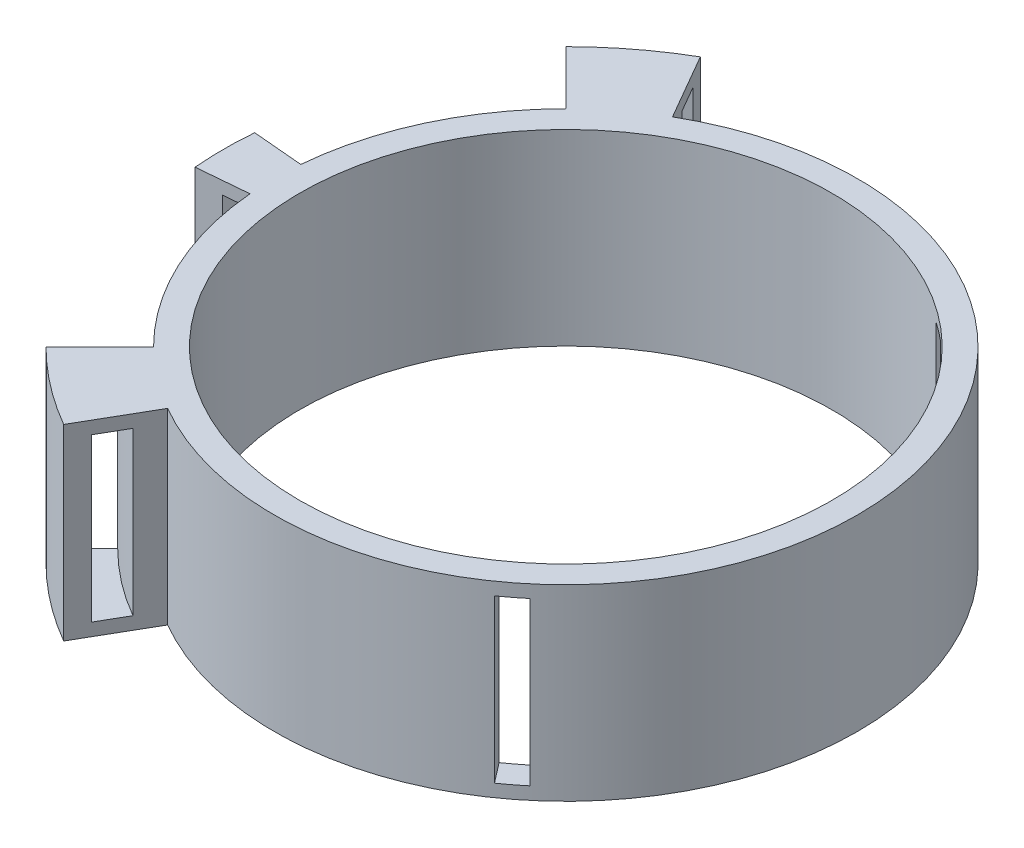
ISO-10303-21;
HEADER;
FILE_DESCRIPTION(('STEP AP214'),'2;1');
FILE_NAME('part.step','',(''),(''),'','','');
FILE_SCHEMA(('AUTOMOTIVE_DESIGN { 1 0 10303 214 1 1 1 1 }'));
ENDSEC;
DATA;
#1=APPLICATION_CONTEXT('core data for automotive mechanical design processes');
#2=APPLICATION_PROTOCOL_DEFINITION('international standard','automotive_design',2000,#1);
#3=PRODUCT_CONTEXT('',#1,'mechanical');
#4=PRODUCT('Part','Part','',(#3));
#5=PRODUCT_RELATED_PRODUCT_CATEGORY('part','',(#4));
#6=PRODUCT_DEFINITION_FORMATION('','',#4);
#7=PRODUCT_DEFINITION_CONTEXT('part definition',#1,'design');
#8=PRODUCT_DEFINITION('design','',#6,#7);
#9=PRODUCT_DEFINITION_SHAPE('','',#8);
#10=(LENGTH_UNIT() NAMED_UNIT(*) SI_UNIT(.MILLI.,.METRE.));
#11=(NAMED_UNIT(*) PLANE_ANGLE_UNIT() SI_UNIT($,.RADIAN.));
#12=(NAMED_UNIT(*) SI_UNIT($,.STERADIAN.) SOLID_ANGLE_UNIT());
#13=UNCERTAINTY_MEASURE_WITH_UNIT(LENGTH_MEASURE(1.E-05),#10,'distance_accuracy_value','');
#14=(GEOMETRIC_REPRESENTATION_CONTEXT(3) GLOBAL_UNCERTAINTY_ASSIGNED_CONTEXT((#13)) GLOBAL_UNIT_ASSIGNED_CONTEXT((#10,
#11,#12)) REPRESENTATION_CONTEXT('',''));
#15=CARTESIAN_POINT('',(0.,0.,0.));
#16=DIRECTION('',(0.,0.,1.));
#17=DIRECTION('',(1.,0.,0.));
#18=AXIS2_PLACEMENT_3D('',#15,#16,#17);
#19=CARTESIAN_POINT('',(0.,0.5,0.));
#20=DIRECTION('',(0.,-1.,0.));
#21=DIRECTION('',(0.,0.,-1.));
#22=AXIS2_PLACEMENT_3D('',#19,#20,#21);
#23=CYLINDRICAL_SURFACE('',#22,11.5);
#24=DIRECTION('',(0.,-1.,0.));
#25=VECTOR('',#24,1.);
#26=CARTESIAN_POINT('',(-11.4562390280551,7.4,1.00229104159798));
#27=LINE('',#26,#25);
#28=CARTESIAN_POINT('',(-11.4562390280551,7.4,1.00229104159798));
#29=VERTEX_POINT('',#28);
#30=CARTESIAN_POINT('',(-11.4562390280551,6.9,1.00229104159798));
#31=VERTEX_POINT('',#30);
#32=EDGE_CURVE('E53',#29,#31,#27,.T.);
#33=ORIENTED_EDGE('',*,*,#32,.T.);
#34=CARTESIAN_POINT('',(1.02175212735034E-12,6.9,0.));
#35=DIRECTION('',(0.,-1.,0.));
#36=DIRECTION('',(0.,0.,1.));
#37=AXIS2_PLACEMENT_3D('',#34,#35,#36);
#38=CIRCLE('',#37,11.500000000001);
#39=CARTESIAN_POINT('',(-11.4562390280551,6.9,-1.002291041598));
#40=VERTEX_POINT('',#39);
#41=EDGE_CURVE('E274',#31,#40,#38,.T.);
#42=ORIENTED_EDGE('',*,*,#41,.T.);
#43=DIRECTION('',(0.,-1.,0.));
#44=VECTOR('',#43,1.);
#45=CARTESIAN_POINT('',(-11.4562390280551,7.4,-1.002291041598));
#46=LINE('',#45,#44);
#47=CARTESIAN_POINT('',(-11.4562390280551,7.4,-1.002291041598));
#48=VERTEX_POINT('',#47);
#49=EDGE_CURVE('E278',#48,#40,#46,.T.);
#50=ORIENTED_EDGE('',*,*,#49,.F.);
#51=CARTESIAN_POINT('',(0.,7.4,0.));
#52=DIRECTION('',(0.,1.,0.));
#53=DIRECTION('',(0.,0.,1.));
#54=AXIS2_PLACEMENT_3D('',#51,#52,#53);
#55=CIRCLE('',#54,11.5);
#56=CARTESIAN_POINT('',(-8.13172798364533,7.4,-8.13172798364527));
#57=VERTEX_POINT('',#56);
#58=EDGE_CURVE('E384',#57,#48,#55,.T.);
#59=ORIENTED_EDGE('',*,*,#58,.F.);
#60=DIRECTION('',(0.,-1.,0.));
#61=VECTOR('',#60,1.);
#62=CARTESIAN_POINT('',(-8.13172798364534,0.5,-8.13172798364525));
#63=LINE('',#62,#61);
#64=CARTESIAN_POINT('',(-8.13172798364534,0.,-8.13172798364525));
#65=VERTEX_POINT('',#64);
#66=EDGE_CURVE('E61',#57,#65,#63,.T.);
#67=ORIENTED_EDGE('',*,*,#66,.T.);
#68=CARTESIAN_POINT('',(0.,0.,0.));
#69=DIRECTION('',(0.,1.,0.));
#70=DIRECTION('',(0.,0.,1.));
#71=AXIS2_PLACEMENT_3D('',#68,#69,#70);
#72=CIRCLE('',#71,11.5);
#73=CARTESIAN_POINT('',(-11.4562390280551,0.,-1.002291041598));
#74=VERTEX_POINT('',#73);
#75=EDGE_CURVE('E478',#65,#74,#72,.T.);
#76=ORIENTED_EDGE('',*,*,#75,.T.);
#77=DIRECTION('',(0.,-1.,0.));
#78=VECTOR('',#77,1.);
#79=CARTESIAN_POINT('',(-11.4562390280551,0.5,-1.002291041598));
#80=LINE('',#79,#78);
#81=CARTESIAN_POINT('',(-11.4562390280551,0.5,-1.002291041598));
#82=VERTEX_POINT('',#81);
#83=EDGE_CURVE('E496',#82,#74,#80,.T.);
#84=ORIENTED_EDGE('',*,*,#83,.F.);
#85=CARTESIAN_POINT('',(0.,0.5,0.));
#86=DIRECTION('',(0.,1.,0.));
#87=DIRECTION('',(0.,0.,1.));
#88=AXIS2_PLACEMENT_3D('',#85,#86,#87);
#89=CIRCLE('',#88,11.5);
#90=CARTESIAN_POINT('',(-11.4562390280551,0.5,1.00229104159798));
#91=VERTEX_POINT('',#90);
#92=EDGE_CURVE('E402',#82,#91,#89,.T.);
#93=ORIENTED_EDGE('',*,*,#92,.T.);
#94=DIRECTION('',(0.,-1.,0.));
#95=VECTOR('',#94,1.);
#96=CARTESIAN_POINT('',(-11.4562390280551,0.5,1.00229104159798));
#97=LINE('',#96,#95);
#98=CARTESIAN_POINT('',(-11.4562390280551,0.,1.00229104159798));
#99=VERTEX_POINT('',#98);
#100=EDGE_CURVE('E258',#91,#99,#97,.T.);
#101=ORIENTED_EDGE('',*,*,#100,.T.);
#102=CARTESIAN_POINT('',(0.,0.,0.));
#103=DIRECTION('',(0.,1.,0.));
#104=DIRECTION('',(0.,0.,1.));
#105=AXIS2_PLACEMENT_3D('',#102,#103,#104);
#106=CIRCLE('',#105,11.5);
#107=CARTESIAN_POINT('',(-8.13172798364534,0.,8.13172798364525));
#108=VERTEX_POINT('',#107);
#109=EDGE_CURVE('E485',#99,#108,#106,.T.);
#110=ORIENTED_EDGE('',*,*,#109,.T.);
#111=DIRECTION('',(0.,-1.,0.));
#112=VECTOR('',#111,1.);
#113=CARTESIAN_POINT('',(-8.13172798364534,0.5,8.13172798364525));
#114=LINE('',#113,#112);
#115=CARTESIAN_POINT('',(-8.13172798364535,7.4,8.13172798364525));
#116=VERTEX_POINT('',#115);
#117=EDGE_CURVE('E490',#116,#108,#114,.T.);
#118=ORIENTED_EDGE('',*,*,#117,.F.);
#119=EDGE_CURVE('E378',#29,#116,#55,.T.);
#120=ORIENTED_EDGE('',*,*,#119,.F.);
#121=EDGE_LOOP('',(#33,#42,#50,#59,#67,#76,#84,#93,#101,#110,#118,#120));
#122=FACE_BOUND('',#121,.T.);
#123=ADVANCED_FACE('F38',(#122),#23,.T.);
#124=DIRECTION('',(0.,-1.,0.));
#125=VECTOR('',#124,1.);
#126=CARTESIAN_POINT('',(6.60150989500399,6.9,9.41647848753261));
#127=LINE('',#126,#125);
#128=CARTESIAN_POINT('',(6.60150989500399,6.9,9.41647848753261));
#129=VERTEX_POINT('',#128);
#130=CARTESIAN_POINT('',(6.60150989500399,0.5,9.41647848753261));
#131=VERTEX_POINT('',#130);
#132=EDGE_CURVE('E426',#129,#131,#127,.T.);
#133=ORIENTED_EDGE('',*,*,#132,.F.);
#134=CARTESIAN_POINT('',(0.,6.9,0.));
#135=DIRECTION('',(0.,1.,0.));
#136=DIRECTION('',(0.,0.,1.));
#137=AXIS2_PLACEMENT_3D('',#134,#135,#136);
#138=CIRCLE('',#137,11.5);
#139=CARTESIAN_POINT('',(7.39205751139518,6.9,8.80951109586827));
#140=VERTEX_POINT('',#139);
#141=EDGE_CURVE('E388',#129,#140,#138,.T.);
#142=ORIENTED_EDGE('',*,*,#141,.T.);
#143=DIRECTION('',(0.,-1.,0.));
#144=VECTOR('',#143,1.);
#145=CARTESIAN_POINT('',(7.39205751139518,6.9,8.80951109586827));
#146=LINE('',#145,#144);
#147=CARTESIAN_POINT('',(7.39205751139518,0.5,8.80951109586827));
#148=VERTEX_POINT('',#147);
#149=EDGE_CURVE('E437',#140,#148,#146,.T.);
#150=ORIENTED_EDGE('',*,*,#149,.T.);
#151=CARTESIAN_POINT('',(0.,0.5,0.));
#152=DIRECTION('',(0.,1.,0.));
#153=DIRECTION('',(0.,0.,1.));
#154=AXIS2_PLACEMENT_3D('',#151,#152,#153);
#155=CIRCLE('',#154,11.5);
#156=EDGE_CURVE('E443',#131,#148,#155,.T.);
#157=ORIENTED_EDGE('',*,*,#156,.F.);
#158=EDGE_LOOP('',(#133,#142,#150,#157));
#159=FACE_BOUND('',#158,.T.);
#160=CARTESIAN_POINT('',(-5.75000000000004,7.4,9.95929214352103));
#161=VERTEX_POINT('',#160);
#162=CARTESIAN_POINT('',(-5.75000000000005,7.4,-9.95929214352102));
#163=VERTEX_POINT('',#162);
#164=EDGE_CURVE('E380',#161,#163,#55,.T.);
#165=ORIENTED_EDGE('',*,*,#164,.F.);
#166=DIRECTION('',(0.,-1.,0.));
#167=VECTOR('',#166,1.);
#168=CARTESIAN_POINT('',(-5.75000000000005,0.5,9.95929214352102));
#169=LINE('',#168,#167);
#170=CARTESIAN_POINT('',(-5.75000000000005,0.,9.95929214352102));
#171=VERTEX_POINT('',#170);
#172=EDGE_CURVE('E46',#161,#171,#169,.T.);
#173=ORIENTED_EDGE('',*,*,#172,.T.);
#174=CARTESIAN_POINT('',(0.,0.,0.));
#175=DIRECTION('',(0.,1.,0.));
#176=DIRECTION('',(0.,0.,1.));
#177=AXIS2_PLACEMENT_3D('',#174,#175,#176);
#178=CIRCLE('',#177,11.5);
#179=CARTESIAN_POINT('',(-5.74999999999991,0.,-9.9592921435211));
#180=VERTEX_POINT('',#179);
#181=EDGE_CURVE('E470',#171,#180,#178,.T.);
#182=ORIENTED_EDGE('',*,*,#181,.T.);
#183=DIRECTION('',(0.,-1.,0.));
#184=VECTOR('',#183,1.);
#185=CARTESIAN_POINT('',(-5.74999999999991,0.5,-9.9592921435211));
#186=LINE('',#185,#184);
#187=EDGE_CURVE('E506',#163,#180,#186,.T.);
#188=ORIENTED_EDGE('',*,*,#187,.F.);
#189=EDGE_LOOP('',(#165,#173,#182,#188));
#190=FACE_BOUND('',#189,.T.);
#191=CARTESIAN_POINT('',(7.34818134856185,6.9,-8.84614214607972));
#192=VERTEX_POINT('',#191);
#193=CARTESIAN_POINT('',(6.55369685374077,6.9,-9.44981785799432));
#194=VERTEX_POINT('',#193);
#195=EDGE_CURVE('E379',#192,#194,#138,.T.);
#196=ORIENTED_EDGE('',*,*,#195,.T.);
#197=DIRECTION('',(0.,-1.,0.));
#198=VECTOR('',#197,1.);
#199=CARTESIAN_POINT('',(6.55369685374077,6.9,-9.44981785799432));
#200=LINE('',#199,#198);
#201=CARTESIAN_POINT('',(6.55369685374077,0.5,-9.44981785799432));
#202=VERTEX_POINT('',#201);
#203=EDGE_CURVE('E410',#194,#202,#200,.T.);
#204=ORIENTED_EDGE('',*,*,#203,.T.);
#205=CARTESIAN_POINT('',(0.,0.5,0.));
#206=DIRECTION('',(0.,1.,0.));
#207=DIRECTION('',(0.,0.,1.));
#208=AXIS2_PLACEMENT_3D('',#205,#206,#207);
#209=CIRCLE('',#208,11.5);
#210=CARTESIAN_POINT('',(7.34818134856185,0.5,-8.84614214607972));
#211=VERTEX_POINT('',#210);
#212=EDGE_CURVE('E449',#211,#202,#209,.T.);
#213=ORIENTED_EDGE('',*,*,#212,.F.);
#214=DIRECTION('',(0.,-1.,0.));
#215=VECTOR('',#214,1.);
#216=CARTESIAN_POINT('',(7.34818134856185,6.9,-8.84614214607972));
#217=LINE('',#216,#215);
#218=EDGE_CURVE('E399',#192,#211,#217,.T.);
#219=ORIENTED_EDGE('',*,*,#218,.F.);
#220=EDGE_LOOP('',(#196,#204,#213,#219));
#221=FACE_BOUND('',#220,.T.);
#222=ADVANCED_FACE('F511',(#159,#190,#221),#23,.T.);
#223=CARTESIAN_POINT('',(0.,0.5,0.));
#224=DIRECTION('',(0.,1.,0.));
#225=DIRECTION('',(0.,0.,1.));
#226=AXIS2_PLACEMENT_3D('',#223,#224,#225);
#227=PLANE('',#226);
#228=DIRECTION('',(-0.996194698091746,0.,-0.0871557427476519));
#229=VECTOR('',#228,1.);
#230=CARTESIAN_POINT('',(-11.4562390280551,0.5,-1.002291041598));
#231=LINE('',#230,#229);
#232=CARTESIAN_POINT('',(-12.4524337261468,0.5,-1.08944678434565));
#233=VERTEX_POINT('',#232);
#234=EDGE_CURVE('E455',#82,#233,#231,.T.);
#235=ORIENTED_EDGE('',*,*,#234,.T.);
#236=CARTESIAN_POINT('',(3.62557206479153E-13,0.5,0.));
#237=DIRECTION('',(0.,-1.,0.));
#238=DIRECTION('',(0.,0.,1.));
#239=AXIS2_PLACEMENT_3D('',#236,#237,#238);
#240=CIRCLE('',#239,12.5000000000004);
#241=CARTESIAN_POINT('',(-12.4524337261468,0.5,1.08944678434563));
#242=VERTEX_POINT('',#241);
#243=EDGE_CURVE('E310',#242,#233,#240,.T.);
#244=ORIENTED_EDGE('',*,*,#243,.F.);
#245=DIRECTION('',(0.996194698091746,0.,-0.0871557427476506));
#246=VECTOR('',#245,1.);
#247=CARTESIAN_POINT('',(-11.4562390280551,0.5,1.00229104159798));
#248=LINE('',#247,#246);
#249=EDGE_CURVE('E457',#242,#91,#248,.T.);
#250=ORIENTED_EDGE('',*,*,#249,.T.);
#251=ORIENTED_EDGE('',*,*,#92,.F.);
#252=EDGE_LOOP('',(#235,#244,#250,#251));
#253=FACE_BOUND('',#252,.T.);
#254=ADVANCED_FACE('F546',(#253),#227,.T.);
#255=DIRECTION('',(0.707106781186551,0.,0.707106781186544));
#256=VECTOR('',#255,1.);
#257=CARTESIAN_POINT('',(-8.13172798364534,0.5,-8.13172798364525));
#258=LINE('',#257,#256);
#259=CARTESIAN_POINT('',(-9.68736290225383,0.5,-9.68736290225461));
#260=VERTEX_POINT('',#259);
#261=CARTESIAN_POINT('',(-8.83883476482951,0.5,-8.83883476482941));
#262=VERTEX_POINT('',#261);
#263=EDGE_CURVE('E453',#260,#262,#258,.T.);
#264=ORIENTED_EDGE('',*,*,#263,.T.);
#265=CARTESIAN_POINT('',(3.50414142147315E-13,0.5,-4.33680868994202E-13));
#266=DIRECTION('',(0.,1.,0.));
#267=DIRECTION('',(0.,0.,-1.));
#268=AXIS2_PLACEMENT_3D('',#265,#266,#267);
#269=CIRCLE('',#268,12.4999999999972);
#270=CARTESIAN_POINT('',(-6.24999999999867,0.5,-10.8253175473034));
#271=VERTEX_POINT('',#270);
#272=EDGE_CURVE('E326',#271,#262,#269,.T.);
#273=ORIENTED_EDGE('',*,*,#272,.F.);
#274=DIRECTION('',(-0.499999999999992,0.,-0.866025403784443));
#275=VECTOR('',#274,1.);
#276=CARTESIAN_POINT('',(-5.74999999999991,0.5,-9.9592921435211));
#277=LINE('',#276,#275);
#278=CARTESIAN_POINT('',(-6.84999999999872,0.5,-11.8645480318448));
#279=VERTEX_POINT('',#278);
#280=EDGE_CURVE('E451',#271,#279,#277,.T.);
#281=ORIENTED_EDGE('',*,*,#280,.T.);
#282=CARTESIAN_POINT('',(3.50414142147315E-13,0.5,-4.33680868994202E-13));
#283=DIRECTION('',(0.,-1.,0.));
#284=DIRECTION('',(0.,0.,-1.));
#285=AXIS2_PLACEMENT_3D('',#282,#283,#284);
#286=CIRCLE('',#285,13.6999999999978);
#287=EDGE_CURVE('E338',#260,#279,#286,.T.);
#288=ORIENTED_EDGE('',*,*,#287,.F.);
#289=EDGE_LOOP('',(#264,#273,#281,#288));
#290=FACE_BOUND('',#289,.T.);
#291=ADVANCED_FACE('F603',(#290),#227,.T.);
#292=DIRECTION('',(-0.707106781186551,0.,0.707106781186544));
#293=VECTOR('',#292,1.);
#294=CARTESIAN_POINT('',(-8.13172798364534,0.5,8.13172798364526));
#295=LINE('',#294,#293);
#296=CARTESIAN_POINT('',(-8.8388347648295,0.5,8.83883476482942));
#297=VERTEX_POINT('',#296);
#298=CARTESIAN_POINT('',(-9.68736290225385,0.5,9.68736290225375));
#299=VERTEX_POINT('',#298);
#300=EDGE_CURVE('E459',#297,#299,#295,.T.);
#301=ORIENTED_EDGE('',*,*,#300,.T.);
#302=CARTESIAN_POINT('',(3.50414142147315E-13,0.5,-4.33680868994202E-13));
#303=DIRECTION('',(0.,-1.,0.));
#304=DIRECTION('',(0.,0.,1.));
#305=AXIS2_PLACEMENT_3D('',#302,#303,#304);
#306=CIRCLE('',#305,13.6999999999978);
#307=CARTESIAN_POINT('',(-6.84999999999871,0.5,11.8645480318444));
#308=VERTEX_POINT('',#307);
#309=EDGE_CURVE('E350',#308,#299,#306,.T.);
#310=ORIENTED_EDGE('',*,*,#309,.F.);
#311=DIRECTION('',(0.500000000000004,0.,-0.866025403784436));
#312=VECTOR('',#311,1.);
#313=CARTESIAN_POINT('',(-5.75000000000005,0.5,9.95929214352102));
#314=LINE('',#313,#312);
#315=CARTESIAN_POINT('',(-6.24999999999836,0.5,10.8253175473025));
#316=VERTEX_POINT('',#315);
#317=EDGE_CURVE('E441',#308,#316,#314,.T.);
#318=ORIENTED_EDGE('',*,*,#317,.T.);
#319=CARTESIAN_POINT('',(3.50414142147315E-13,0.5,-4.33680868994202E-13));
#320=DIRECTION('',(0.,1.,0.));
#321=DIRECTION('',(0.,0.,1.));
#322=AXIS2_PLACEMENT_3D('',#319,#320,#321);
#323=CIRCLE('',#322,12.4999999999972);
#324=EDGE_CURVE('E362',#297,#316,#323,.T.);
#325=ORIENTED_EDGE('',*,*,#324,.F.);
#326=EDGE_LOOP('',(#301,#310,#318,#325));
#327=FACE_BOUND('',#326,.T.);
#328=ADVANCED_FACE('F598',(#327),#227,.T.);
#329=CARTESIAN_POINT('',(0.,0.5,0.));
#330=DIRECTION('',(0.,-1.,0.));
#331=DIRECTION('',(0.,0.,1.));
#332=AXIS2_PLACEMENT_3D('',#329,#330,#331);
#333=CIRCLE('',#332,10.5);
#334=CARTESIAN_POINT('',(5.94807324018505,0.5,-8.65276977212468));
#335=VERTEX_POINT('',#334);
#336=CARTESIAN_POINT('',(6.70920905738256,0.5,-8.0769123942467));
#337=VERTEX_POINT('',#336);
#338=EDGE_CURVE('E446',#335,#337,#333,.T.);
#339=ORIENTED_EDGE('',*,*,#338,.T.);
#340=DIRECTION('',(-0.638972291179291,0.,0.769229751833019));
#341=VECTOR('',#340,1.);
#342=CARTESIAN_POINT('',(0.,0.5,0.));
#343=LINE('',#342,#341);
#344=EDGE_CURVE('E383',#211,#337,#343,.T.);
#345=ORIENTED_EDGE('',*,*,#344,.F.);
#346=ORIENTED_EDGE('',*,*,#212,.T.);
#347=DIRECTION('',(0.604999089059934,0.,-0.796226162743131));
#348=VECTOR('',#347,1.);
#349=CARTESIAN_POINT('',(-0.397242247410538,0.5,-0.301837855957302));
#350=LINE('',#349,#348);
#351=EDGE_CURVE('E407',#335,#202,#350,.T.);
#352=ORIENTED_EDGE('',*,*,#351,.F.);
#353=EDGE_LOOP('',(#339,#345,#346,#352));
#354=FACE_BOUND('',#353,.T.);
#355=ADVANCED_FACE('F595',(#354),#227,.T.);
#356=CARTESIAN_POINT('',(6.74926990170864,0.5,8.04346665274929));
#357=VERTEX_POINT('',#356);
#358=CARTESIAN_POINT('',(5.99189464633235,0.5,8.62248215696929));
#359=VERTEX_POINT('',#358);
#360=EDGE_CURVE('E447',#357,#359,#333,.T.);
#361=ORIENTED_EDGE('',*,*,#360,.T.);
#362=DIRECTION('',(-0.608988032530659,0.,-0.793179409865408));
#363=VECTOR('',#362,1.);
#364=CARTESIAN_POINT('',(-0.395273808195626,0.5,0.303483695832197));
#365=LINE('',#364,#363);
#366=EDGE_CURVE('E413',#131,#359,#365,.T.);
#367=ORIENTED_EDGE('',*,*,#366,.F.);
#368=ORIENTED_EDGE('',*,*,#156,.T.);
#369=DIRECTION('',(-0.642787609686537,0.,-0.76604444311898));
#370=VECTOR('',#369,1.);
#371=CARTESIAN_POINT('',(0.,0.5,0.));
#372=LINE('',#371,#370);
#373=EDGE_CURVE('E429',#148,#357,#372,.T.);
#374=ORIENTED_EDGE('',*,*,#373,.T.);
#375=EDGE_LOOP('',(#361,#367,#368,#374));
#376=FACE_BOUND('',#375,.T.);
#377=ADVANCED_FACE('F591',(#376),#227,.T.);
#378=CARTESIAN_POINT('',(0.,0.5,0.));
#379=DIRECTION('',(0.,-1.,0.));
#380=DIRECTION('',(0.,0.,-1.));
#381=AXIS2_PLACEMENT_3D('',#378,#379,#380);
#382=CYLINDRICAL_SURFACE('',#381,14.5);
#383=CARTESIAN_POINT('',(0.,0.,0.));
#384=DIRECTION('',(0.,1.,0.));
#385=DIRECTION('',(0.,0.,1.));
#386=AXIS2_PLACEMENT_3D('',#383,#384,#385);
#387=CIRCLE('',#386,14.5);
#388=CARTESIAN_POINT('',(-10.253048327205,0.,10.2530483272049));
#389=VERTEX_POINT('',#388);
#390=CARTESIAN_POINT('',(-7.25000000000006,0.,12.5573683548743));
#391=VERTEX_POINT('',#390);
#392=EDGE_CURVE('E440',#389,#391,#387,.T.);
#393=ORIENTED_EDGE('',*,*,#392,.T.);
#394=DIRECTION('',(0.,-1.,0.));
#395=VECTOR('',#394,1.);
#396=CARTESIAN_POINT('',(-7.25000000000006,0.5,12.5573683548743));
#397=LINE('',#396,#395);
#398=CARTESIAN_POINT('',(-7.25000000000006,7.4,12.5573683548743));
#399=VERTEX_POINT('',#398);
#400=EDGE_CURVE('E11',#399,#391,#397,.T.);
#401=ORIENTED_EDGE('',*,*,#400,.F.);
#402=CARTESIAN_POINT('',(0.,7.4,0.));
#403=DIRECTION('',(0.,1.,0.));
#404=DIRECTION('',(0.,0.,-1.));
#405=AXIS2_PLACEMENT_3D('',#402,#403,#404);
#406=CIRCLE('',#405,14.5000000000001);
#407=CARTESIAN_POINT('',(-10.253048327205,7.4,10.2530483272049));
#408=VERTEX_POINT('',#407);
#409=EDGE_CURVE('E304',#408,#399,#406,.T.);
#410=ORIENTED_EDGE('',*,*,#409,.F.);
#411=DIRECTION('',(0.,-1.,0.));
#412=VECTOR('',#411,1.);
#413=CARTESIAN_POINT('',(-10.253048327205,0.5,10.2530483272049));
#414=LINE('',#413,#412);
#415=EDGE_CURVE('E461',#408,#389,#414,.T.);
#416=ORIENTED_EDGE('',*,*,#415,.T.);
#417=EDGE_LOOP('',(#393,#401,#410,#416));
#418=FACE_BOUND('',#417,.T.);
#419=ADVANCED_FACE('F40',(#418),#382,.T.);
#420=CARTESIAN_POINT('',(-5.75000000000005,0.5,9.95929214352102));
#421=DIRECTION('',(-0.866025403784436,0.,-0.500000000000004));
#422=DIRECTION('',(-0.500000000000004,0.,0.866025403784436));
#423=AXIS2_PLACEMENT_3D('',#420,#421,#422);
#424=PLANE('',#423);
#425=ORIENTED_EDGE('',*,*,#172,.F.);
#426=DIRECTION('',(0.500000000000003,0.,-0.866025403784437));
#427=VECTOR('',#426,1.);
#428=CARTESIAN_POINT('',(-7.25000000000006,7.4,12.5573683548743));
#429=LINE('',#428,#427);
#430=EDGE_CURVE('E308',#399,#161,#429,.T.);
#431=ORIENTED_EDGE('',*,*,#430,.F.);
#432=ORIENTED_EDGE('',*,*,#400,.T.);
#433=DIRECTION('',(0.500000000000004,0.,-0.866025403784436));
#434=VECTOR('',#433,1.);
#435=CARTESIAN_POINT('',(-5.75000000000005,0.,9.95929214352102));
#436=LINE('',#435,#434);
#437=EDGE_CURVE('E464',#391,#171,#436,.T.);
#438=ORIENTED_EDGE('',*,*,#437,.T.);
#439=EDGE_LOOP('',(#425,#431,#432,#438));
#440=FACE_BOUND('',#439,.T.);
#441=DIRECTION('',(0.500000000000003,0.,-0.866025403784437));
#442=VECTOR('',#441,1.);
#443=CARTESIAN_POINT('',(-7.25000000000006,6.9,12.5573683548743));
#444=LINE('',#443,#442);
#445=CARTESIAN_POINT('',(-6.84999999999876,6.9,11.8645480318445));
#446=VERTEX_POINT('',#445);
#447=CARTESIAN_POINT('',(-6.24999999999837,6.9,10.8253175473025));
#448=VERTEX_POINT('',#447);
#449=EDGE_CURVE('E305',#446,#448,#444,.T.);
#450=ORIENTED_EDGE('',*,*,#449,.T.);
#451=DIRECTION('',(0.,-1.,0.));
#452=VECTOR('',#451,1.);
#453=CARTESIAN_POINT('',(-6.24999999999837,6.9,10.8253175473025));
#454=LINE('',#453,#452);
#455=EDGE_CURVE('E366',#448,#316,#454,.T.);
#456=ORIENTED_EDGE('',*,*,#455,.T.);
#457=ORIENTED_EDGE('',*,*,#317,.F.);
#458=DIRECTION('',(0.,-1.,0.));
#459=VECTOR('',#458,1.);
#460=CARTESIAN_POINT('',(-6.84999999999871,6.9,11.8645480318444));
#461=LINE('',#460,#459);
#462=EDGE_CURVE('E359',#446,#308,#461,.T.);
#463=ORIENTED_EDGE('',*,*,#462,.F.);
#464=EDGE_LOOP('',(#450,#456,#457,#463));
#465=FACE_BOUND('',#464,.T.);
#466=ADVANCED_FACE('F515',(#440,#465),#424,.F.);
#467=CARTESIAN_POINT('',(0.,0.5,0.));
#468=DIRECTION('',(0.,-1.,0.));
#469=DIRECTION('',(0.,0.,-1.));
#470=AXIS2_PLACEMENT_3D('',#467,#468,#469);
#471=CYLINDRICAL_SURFACE('',#470,10.5);
#472=CARTESIAN_POINT('',(0.,0.,0.));
#473=DIRECTION('',(0.,-1.,0.));
#474=DIRECTION('',(0.,0.,1.));
#475=AXIS2_PLACEMENT_3D('',#472,#473,#474);
#476=CIRCLE('',#475,10.5);
#477=CARTESIAN_POINT('',(0.,0.,10.5));
#478=VERTEX_POINT('',#477);
#479=EDGE_CURVE('E467',#478,#478,#476,.T.);
#480=ORIENTED_EDGE('',*,*,#479,.T.);
#481=EDGE_LOOP('',(#480));
#482=FACE_BOUND('',#481,.T.);
#483=DIRECTION('',(0.,-1.,0.));
#484=VECTOR('',#483,1.);
#485=CARTESIAN_POINT('',(6.74926990170864,6.9,8.04346665274929));
#486=LINE('',#485,#484);
#487=CARTESIAN_POINT('',(6.74926990170864,6.9,8.04346665274929));
#488=VERTEX_POINT('',#487);
#489=EDGE_CURVE('E433',#488,#357,#486,.T.);
#490=ORIENTED_EDGE('',*,*,#489,.F.);
#491=CARTESIAN_POINT('',(0.,6.9,0.));
#492=DIRECTION('',(0.,-1.,0.));
#493=DIRECTION('',(0.,0.,1.));
#494=AXIS2_PLACEMENT_3D('',#491,#492,#493);
#495=CIRCLE('',#494,10.5);
#496=CARTESIAN_POINT('',(5.99189464633235,6.9,8.62248215696929));
#497=VERTEX_POINT('',#496);
#498=EDGE_CURVE('E387',#488,#497,#495,.T.);
#499=ORIENTED_EDGE('',*,*,#498,.T.);
#500=DIRECTION('',(0.,-1.,0.));
#501=VECTOR('',#500,1.);
#502=CARTESIAN_POINT('',(5.99189464633235,6.9,8.62248215696929));
#503=LINE('',#502,#501);
#504=EDGE_CURVE('E423',#497,#359,#503,.T.);
#505=ORIENTED_EDGE('',*,*,#504,.T.);
#506=ORIENTED_EDGE('',*,*,#360,.F.);
#507=EDGE_LOOP('',(#490,#499,#505,#506));
#508=FACE_BOUND('',#507,.T.);
#509=DIRECTION('',(0.,-1.,0.));
#510=VECTOR('',#509,1.);
#511=CARTESIAN_POINT('',(5.94807324018505,6.9,-8.65276977212468));
#512=LINE('',#511,#510);
#513=CARTESIAN_POINT('',(5.94807324018505,6.9,-8.65276977212468));
#514=VERTEX_POINT('',#513);
#515=EDGE_CURVE('E420',#514,#335,#512,.T.);
#516=ORIENTED_EDGE('',*,*,#515,.F.);
#517=CARTESIAN_POINT('',(6.70920905738256,6.9,-8.0769123942467));
#518=VERTEX_POINT('',#517);
#519=EDGE_CURVE('E374',#514,#518,#495,.T.);
#520=ORIENTED_EDGE('',*,*,#519,.T.);
#521=DIRECTION('',(0.,-1.,0.));
#522=VECTOR('',#521,1.);
#523=CARTESIAN_POINT('',(6.70920905738256,6.9,-8.0769123942467));
#524=LINE('',#523,#522);
#525=EDGE_CURVE('E394',#518,#337,#524,.T.);
#526=ORIENTED_EDGE('',*,*,#525,.T.);
#527=ORIENTED_EDGE('',*,*,#338,.F.);
#528=EDGE_LOOP('',(#516,#520,#526,#527));
#529=FACE_BOUND('',#528,.T.);
#530=CARTESIAN_POINT('',(0.,7.4,0.));
#531=DIRECTION('',(0.,-1.,0.));
#532=DIRECTION('',(0.,0.,1.));
#533=AXIS2_PLACEMENT_3D('',#530,#531,#532);
#534=CIRCLE('',#533,10.5);
#535=CARTESIAN_POINT('',(0.,7.4,10.5));
#536=VERTEX_POINT('',#535);
#537=EDGE_CURVE('E375',#536,#536,#534,.T.);
#538=ORIENTED_EDGE('',*,*,#537,.F.);
#539=EDGE_LOOP('',(#538));
#540=FACE_BOUND('',#539,.T.);
#541=ADVANCED_FACE('F584',(#482,#508,#529,#540),#471,.F.);
#542=CARTESIAN_POINT('',(-5.74999999999991,0.5,-9.9592921435211));
#543=DIRECTION('',(-0.866025403784443,0.,0.499999999999992));
#544=DIRECTION('',(0.499999999999992,0.,0.866025403784443));
#545=AXIS2_PLACEMENT_3D('',#542,#543,#544);
#546=PLANE('',#545);
#547=DIRECTION('',(0.,-1.,0.));
#548=VECTOR('',#547,1.);
#549=CARTESIAN_POINT('',(-7.24999999999989,0.5,-12.5573683548744));
#550=LINE('',#549,#548);
#551=CARTESIAN_POINT('',(-7.25000000000006,7.4,-12.5573683548743));
#552=VERTEX_POINT('',#551);
#553=CARTESIAN_POINT('',(-7.24999999999989,0.,-12.5573683548744));
#554=VERTEX_POINT('',#553);
#555=EDGE_CURVE('E503',#552,#554,#550,.T.);
#556=ORIENTED_EDGE('',*,*,#555,.F.);
#557=DIRECTION('',(-0.500000000000004,0.,-0.866025403784436));
#558=VECTOR('',#557,1.);
#559=CARTESIAN_POINT('',(-7.25000000000006,7.4,-12.5573683548743));
#560=LINE('',#559,#558);
#561=EDGE_CURVE('E293',#163,#552,#560,.T.);
#562=ORIENTED_EDGE('',*,*,#561,.F.);
#563=ORIENTED_EDGE('',*,*,#187,.T.);
#564=DIRECTION('',(-0.499999999999992,0.,-0.866025403784443));
#565=VECTOR('',#564,1.);
#566=CARTESIAN_POINT('',(-5.74999999999991,0.,-9.9592921435211));
#567=LINE('',#566,#565);
#568=EDGE_CURVE('E472',#180,#554,#567,.T.);
#569=ORIENTED_EDGE('',*,*,#568,.T.);
#570=EDGE_LOOP('',(#556,#562,#563,#569));
#571=FACE_BOUND('',#570,.T.);
#572=DIRECTION('',(-0.500000000000004,0.,-0.866025403784436));
#573=VECTOR('',#572,1.);
#574=CARTESIAN_POINT('',(-7.25000000000006,6.9,-12.5573683548743));
#575=LINE('',#574,#573);
#576=CARTESIAN_POINT('',(-6.24999999999879,6.9,-10.8253175473033));
#577=VERTEX_POINT('',#576);
#578=CARTESIAN_POINT('',(-6.84999999999872,6.9,-11.8645480318453));
#579=VERTEX_POINT('',#578);
#580=EDGE_CURVE('E290',#577,#579,#575,.T.);
#581=ORIENTED_EDGE('',*,*,#580,.T.);
#582=DIRECTION('',(0.,-1.,0.));
#583=VECTOR('',#582,1.);
#584=CARTESIAN_POINT('',(-6.84999999999872,6.9,-11.8645480318453));
#585=LINE('',#584,#583);
#586=EDGE_CURVE('E342',#579,#279,#585,.T.);
#587=ORIENTED_EDGE('',*,*,#586,.T.);
#588=ORIENTED_EDGE('',*,*,#280,.F.);
#589=DIRECTION('',(0.,-1.,0.));
#590=VECTOR('',#589,1.);
#591=CARTESIAN_POINT('',(-6.24999999999838,6.9,-10.8253175473034));
#592=LINE('',#591,#590);
#593=EDGE_CURVE('E335',#577,#271,#592,.T.);
#594=ORIENTED_EDGE('',*,*,#593,.F.);
#595=EDGE_LOOP('',(#581,#587,#588,#594));
#596=FACE_BOUND('',#595,.T.);
#597=ADVANCED_FACE('F531',(#571,#596),#546,.F.);
#598=CARTESIAN_POINT('',(0.,0.5,0.));
#599=DIRECTION('',(0.,-1.,0.));
#600=DIRECTION('',(0.,0.,-1.));
#601=AXIS2_PLACEMENT_3D('',#598,#599,#600);
#602=CYLINDRICAL_SURFACE('',#601,14.5);
#603=CARTESIAN_POINT('',(0.,0.,0.));
#604=DIRECTION('',(0.,1.,0.));
#605=DIRECTION('',(0.,0.,1.));
#606=AXIS2_PLACEMENT_3D('',#603,#604,#605);
#607=CIRCLE('',#606,14.5);
#608=CARTESIAN_POINT('',(-10.253048327205,0.,-10.2530483272049));
#609=VERTEX_POINT('',#608);
#610=EDGE_CURVE('E474',#554,#609,#607,.T.);
#611=ORIENTED_EDGE('',*,*,#610,.T.);
#612=DIRECTION('',(0.,-1.,0.));
#613=VECTOR('',#612,1.);
#614=CARTESIAN_POINT('',(-10.253048327205,0.5,-10.2530483272049));
#615=LINE('',#614,#613);
#616=CARTESIAN_POINT('',(-10.253048327205,7.4,-10.2530483272049));
#617=VERTEX_POINT('',#616);
#618=EDGE_CURVE('E500',#617,#609,#615,.T.);
#619=ORIENTED_EDGE('',*,*,#618,.F.);
#620=CARTESIAN_POINT('',(0.,7.4,0.));
#621=DIRECTION('',(0.,1.,0.));
#622=DIRECTION('',(0.,0.,1.));
#623=AXIS2_PLACEMENT_3D('',#620,#621,#622);
#624=CIRCLE('',#623,14.5);
#625=EDGE_CURVE('E286',#552,#617,#624,.T.);
#626=ORIENTED_EDGE('',*,*,#625,.F.);
#627=ORIENTED_EDGE('',*,*,#555,.T.);
#628=EDGE_LOOP('',(#611,#619,#626,#627));
#629=FACE_BOUND('',#628,.T.);
#630=ADVANCED_FACE('F535',(#629),#602,.T.);
#631=CARTESIAN_POINT('',(-8.13172798364534,0.5,-8.13172798364525));
#632=DIRECTION('',(0.707106781186544,0.,-0.707106781186551));
#633=DIRECTION('',(-0.707106781186551,0.,-0.707106781186544));
#634=AXIS2_PLACEMENT_3D('',#631,#632,#633);
#635=PLANE('',#634);
#636=DIRECTION('',(0.,-1.,0.));
#637=VECTOR('',#636,1.);
#638=CARTESIAN_POINT('',(-9.68736290225383,6.9,-9.68736290225461));
#639=LINE('',#638,#637);
#640=CARTESIAN_POINT('',(-9.68736290225383,6.9,-9.68736290225461));
#641=VERTEX_POINT('',#640);
#642=EDGE_CURVE('E347',#641,#260,#639,.T.);
#643=ORIENTED_EDGE('',*,*,#642,.F.);
#644=DIRECTION('',(0.707106781186552,0.,0.707106781186543));
#645=VECTOR('',#644,1.);
#646=CARTESIAN_POINT('',(-8.13172798364534,6.9,-8.13172798364527));
#647=LINE('',#646,#645);
#648=CARTESIAN_POINT('',(-8.83883476482951,6.9,-8.83883476483029));
#649=VERTEX_POINT('',#648);
#650=EDGE_CURVE('E285',#641,#649,#647,.T.);
#651=ORIENTED_EDGE('',*,*,#650,.T.);
#652=DIRECTION('',(0.,-1.,0.));
#653=VECTOR('',#652,1.);
#654=CARTESIAN_POINT('',(-8.83883476482951,6.9,-8.83883476483029));
#655=LINE('',#654,#653);
#656=EDGE_CURVE('E330',#649,#262,#655,.T.);
#657=ORIENTED_EDGE('',*,*,#656,.T.);
#658=ORIENTED_EDGE('',*,*,#263,.F.);
#659=EDGE_LOOP('',(#643,#651,#657,#658));
#660=FACE_BOUND('',#659,.T.);
#661=DIRECTION('',(0.707106781186551,0.,0.707106781186544));
#662=VECTOR('',#661,1.);
#663=CARTESIAN_POINT('',(-8.13172798364534,0.,-8.13172798364525));
#664=LINE('',#663,#662);
#665=EDGE_CURVE('E476',#609,#65,#664,.T.);
#666=ORIENTED_EDGE('',*,*,#665,.T.);
#667=ORIENTED_EDGE('',*,*,#66,.F.);
#668=DIRECTION('',(0.707106781186552,0.,0.707106781186543));
#669=VECTOR('',#668,1.);
#670=CARTESIAN_POINT('',(-8.13172798364534,7.4,-8.13172798364527));
#671=LINE('',#670,#669);
#672=EDGE_CURVE('E289',#617,#57,#671,.T.);
#673=ORIENTED_EDGE('',*,*,#672,.F.);
#674=ORIENTED_EDGE('',*,*,#618,.T.);
#675=EDGE_LOOP('',(#666,#667,#673,#674));
#676=FACE_BOUND('',#675,.T.);
#677=ADVANCED_FACE('F536',(#660,#676),#635,.F.);
#678=CARTESIAN_POINT('',(-11.4562390280551,0.5,-1.002291041598));
#679=DIRECTION('',(-0.0871557427476519,0.,0.996194698091746));
#680=DIRECTION('',(0.996194698091746,0.,0.0871557427476519));
#681=AXIS2_PLACEMENT_3D('',#678,#679,#680);
#682=PLANE('',#681);
#683=DIRECTION('',(-0.996194698091746,0.,-0.0871557427476519));
#684=VECTOR('',#683,1.);
#685=CARTESIAN_POINT('',(-11.4562390280551,0.,-1.002291041598));
#686=LINE('',#685,#684);
#687=CARTESIAN_POINT('',(-13.4486284242386,0.,-1.1766025270933));
#688=VERTEX_POINT('',#687);
#689=EDGE_CURVE('E480',#74,#688,#686,.T.);
#690=ORIENTED_EDGE('',*,*,#689,.T.);
#691=DIRECTION('',(0.,-1.,0.));
#692=VECTOR('',#691,1.);
#693=CARTESIAN_POINT('',(-13.4486284242386,0.5,-1.1766025270933));
#694=LINE('',#693,#692);
#695=CARTESIAN_POINT('',(-13.4486284242386,7.4,-1.1766025270933));
#696=VERTEX_POINT('',#695);
#697=EDGE_CURVE('E257',#696,#688,#694,.T.);
#698=ORIENTED_EDGE('',*,*,#697,.F.);
#699=DIRECTION('',(-0.996194698091746,0.,-0.0871557427476499));
#700=VECTOR('',#699,1.);
#701=CARTESIAN_POINT('',(-13.4486284242386,7.4,-1.1766025270933));
#702=LINE('',#701,#700);
#703=EDGE_CURVE('E264',#48,#696,#702,.T.);
#704=ORIENTED_EDGE('',*,*,#703,.F.);
#705=ORIENTED_EDGE('',*,*,#49,.T.);
#706=DIRECTION('',(-0.996194698091746,0.,-0.0871557427476499));
#707=VECTOR('',#706,1.);
#708=CARTESIAN_POINT('',(-13.4486284242386,6.9,-1.1766025270933));
#709=LINE('',#708,#707);
#710=CARTESIAN_POINT('',(-12.4524337261468,6.9,-1.08944678434565));
#711=VERTEX_POINT('',#710);
#712=EDGE_CURVE('E271',#40,#711,#709,.T.);
#713=ORIENTED_EDGE('',*,*,#712,.T.);
#714=DIRECTION('',(0.,-1.,0.));
#715=VECTOR('',#714,1.);
#716=CARTESIAN_POINT('',(-12.4524337261468,6.9,-1.08944678434565));
#717=LINE('',#716,#715);
#718=EDGE_CURVE('E318',#711,#233,#717,.T.);
#719=ORIENTED_EDGE('',*,*,#718,.T.);
#720=ORIENTED_EDGE('',*,*,#234,.F.);
#721=ORIENTED_EDGE('',*,*,#83,.T.);
#722=EDGE_LOOP('',(#690,#698,#704,#705,#713,#719,#720,#721));
#723=FACE_BOUND('',#722,.T.);
#724=ADVANCED_FACE('F543',(#723),#682,.F.);
#725=CARTESIAN_POINT('',(0.,0.5,0.));
#726=DIRECTION('',(0.,-1.,0.));
#727=DIRECTION('',(0.,0.,-1.));
#728=AXIS2_PLACEMENT_3D('',#725,#726,#727);
#729=CYLINDRICAL_SURFACE('',#728,13.5);
#730=CARTESIAN_POINT('',(0.,0.,0.));
#731=DIRECTION('',(0.,1.,0.));
#732=DIRECTION('',(0.,0.,1.));
#733=AXIS2_PLACEMENT_3D('',#730,#731,#732);
#734=CIRCLE('',#733,13.5);
#735=CARTESIAN_POINT('',(-13.4486284242386,0.,1.17660252709328));
#736=VERTEX_POINT('',#735);
#737=EDGE_CURVE('E255',#688,#736,#734,.T.);
#738=ORIENTED_EDGE('',*,*,#737,.T.);
#739=DIRECTION('',(0.,-1.,0.));
#740=VECTOR('',#739,1.);
#741=CARTESIAN_POINT('',(-13.4486284242386,0.5,1.17660252709328));
#742=LINE('',#741,#740);
#743=CARTESIAN_POINT('',(-13.4486284242386,7.4,1.17660252709328));
#744=VERTEX_POINT('',#743);
#745=EDGE_CURVE('E249',#744,#736,#742,.T.);
#746=ORIENTED_EDGE('',*,*,#745,.F.);
#747=CARTESIAN_POINT('',(3.71230823859037E-13,7.4,0.));
#748=DIRECTION('',(0.,1.,0.));
#749=DIRECTION('',(0.,0.,1.));
#750=AXIS2_PLACEMENT_3D('',#747,#748,#749);
#751=CIRCLE('',#750,13.5000000000004);
#752=EDGE_CURVE('E253',#696,#744,#751,.T.);
#753=ORIENTED_EDGE('',*,*,#752,.F.);
#754=ORIENTED_EDGE('',*,*,#697,.T.);
#755=EDGE_LOOP('',(#738,#746,#753,#754));
#756=FACE_BOUND('',#755,.T.);
#757=ADVANCED_FACE('F250',(#756),#729,.T.);
#758=CARTESIAN_POINT('',(-11.4562390280551,0.5,1.00229104159798));
#759=DIRECTION('',(-0.0871557427476506,0.,-0.996194698091746));
#760=DIRECTION('',(-0.996194698091746,0.,0.0871557427476506));
#761=AXIS2_PLACEMENT_3D('',#758,#759,#760);
#762=PLANE('',#761);
#763=DIRECTION('',(0.996194698091746,0.,-0.0871557427476506));
#764=VECTOR('',#763,1.);
#765=CARTESIAN_POINT('',(-11.4562390280551,0.,1.00229104159798));
#766=LINE('',#765,#764);
#767=EDGE_CURVE('E483',#736,#99,#766,.T.);
#768=ORIENTED_EDGE('',*,*,#767,.T.);
#769=ORIENTED_EDGE('',*,*,#100,.F.);
#770=ORIENTED_EDGE('',*,*,#249,.F.);
#771=DIRECTION('',(0.,-1.,0.));
#772=VECTOR('',#771,1.);
#773=CARTESIAN_POINT('',(-12.4524337261468,6.9,1.08944678434563));
#774=LINE('',#773,#772);
#775=CARTESIAN_POINT('',(-12.4524337261468,6.9,1.08944678434563));
#776=VERTEX_POINT('',#775);
#777=EDGE_CURVE('E323',#776,#242,#774,.T.);
#778=ORIENTED_EDGE('',*,*,#777,.F.);
#779=DIRECTION('',(0.996194698091747,0.,-0.087155742747644));
#780=VECTOR('',#779,1.);
#781=CARTESIAN_POINT('',(-13.4486284242386,6.9,1.17660252709328));
#782=LINE('',#781,#780);
#783=EDGE_CURVE('E279',#776,#31,#782,.T.);
#784=ORIENTED_EDGE('',*,*,#783,.T.);
#785=ORIENTED_EDGE('',*,*,#32,.F.);
#786=DIRECTION('',(0.996194698091747,0.,-0.087155742747644));
#787=VECTOR('',#786,1.);
#788=CARTESIAN_POINT('',(-13.4486284242386,7.4,1.17660252709328));
#789=LINE('',#788,#787);
#790=EDGE_CURVE('E260',#744,#29,#789,.T.);
#791=ORIENTED_EDGE('',*,*,#790,.F.);
#792=ORIENTED_EDGE('',*,*,#745,.T.);
#793=EDGE_LOOP('',(#768,#769,#770,#778,#784,#785,#791,#792));
#794=FACE_BOUND('',#793,.T.);
#795=ADVANCED_FACE('F261',(#794),#762,.F.);
#796=CARTESIAN_POINT('',(-8.13172798364534,0.5,8.13172798364526));
#797=DIRECTION('',(0.707106781186544,0.,0.707106781186551));
#798=DIRECTION('',(0.707106781186551,0.,-0.707106781186544));
#799=AXIS2_PLACEMENT_3D('',#796,#797,#798);
#800=PLANE('',#799);
#801=DIRECTION('',(0.,-1.,0.));
#802=VECTOR('',#801,1.);
#803=CARTESIAN_POINT('',(-8.8388347648295,6.9,8.83883476482942));
#804=LINE('',#803,#802);
#805=CARTESIAN_POINT('',(-8.8388347648295,6.9,8.83883476482942));
#806=VERTEX_POINT('',#805);
#807=EDGE_CURVE('E371',#806,#297,#804,.T.);
#808=ORIENTED_EDGE('',*,*,#807,.F.);
#809=DIRECTION('',(-0.707106781186552,0.,0.707106781186543));
#810=VECTOR('',#809,1.);
#811=CARTESIAN_POINT('',(-8.13172798364534,6.9,8.13172798364526));
#812=LINE('',#811,#810);
#813=CARTESIAN_POINT('',(-9.68736290225383,6.9,9.68736290225375));
#814=VERTEX_POINT('',#813);
#815=EDGE_CURVE('E296',#806,#814,#812,.T.);
#816=ORIENTED_EDGE('',*,*,#815,.T.);
#817=DIRECTION('',(0.,-1.,0.));
#818=VECTOR('',#817,1.);
#819=CARTESIAN_POINT('',(-9.68736290225383,6.9,9.68736290225375));
#820=LINE('',#819,#818);
#821=EDGE_CURVE('E354',#814,#299,#820,.T.);
#822=ORIENTED_EDGE('',*,*,#821,.T.);
#823=ORIENTED_EDGE('',*,*,#300,.F.);
#824=EDGE_LOOP('',(#808,#816,#822,#823));
#825=FACE_BOUND('',#824,.T.);
#826=DIRECTION('',(-0.707106781186551,0.,0.707106781186544));
#827=VECTOR('',#826,1.);
#828=CARTESIAN_POINT('',(-8.13172798364534,0.,8.13172798364526));
#829=LINE('',#828,#827);
#830=EDGE_CURVE('E444',#108,#389,#829,.T.);
#831=ORIENTED_EDGE('',*,*,#830,.T.);
#832=ORIENTED_EDGE('',*,*,#415,.F.);
#833=DIRECTION('',(-0.707106781186552,0.,0.707106781186543));
#834=VECTOR('',#833,1.);
#835=CARTESIAN_POINT('',(-8.13172798364534,7.4,8.13172798364526));
#836=LINE('',#835,#834);
#837=EDGE_CURVE('E301',#116,#408,#836,.T.);
#838=ORIENTED_EDGE('',*,*,#837,.F.);
#839=ORIENTED_EDGE('',*,*,#117,.T.);
#840=EDGE_LOOP('',(#831,#832,#838,#839));
#841=FACE_BOUND('',#840,.T.);
#842=ADVANCED_FACE('F555',(#825,#841),#800,.F.);
#843=CARTESIAN_POINT('',(0.,0.,0.));
#844=DIRECTION('',(0.,1.,0.));
#845=DIRECTION('',(0.,0.,1.));
#846=AXIS2_PLACEMENT_3D('',#843,#844,#845);
#847=PLANE('',#846);
#848=ORIENTED_EDGE('',*,*,#181,.F.);
#849=ORIENTED_EDGE('',*,*,#437,.F.);
#850=ORIENTED_EDGE('',*,*,#392,.F.);
#851=ORIENTED_EDGE('',*,*,#830,.F.);
#852=ORIENTED_EDGE('',*,*,#109,.F.);
#853=ORIENTED_EDGE('',*,*,#767,.F.);
#854=ORIENTED_EDGE('',*,*,#737,.F.);
#855=ORIENTED_EDGE('',*,*,#689,.F.);
#856=ORIENTED_EDGE('',*,*,#75,.F.);
#857=ORIENTED_EDGE('',*,*,#665,.F.);
#858=ORIENTED_EDGE('',*,*,#610,.F.);
#859=ORIENTED_EDGE('',*,*,#568,.F.);
#860=EDGE_LOOP('',(#848,#849,#850,#851,#852,#853,#854,#855,#856,#857,#858,#859));
#861=FACE_BOUND('',#860,.T.);
#862=ORIENTED_EDGE('',*,*,#479,.F.);
#863=EDGE_LOOP('',(#862));
#864=FACE_BOUND('',#863,.T.);
#865=ADVANCED_FACE('F524',(#861,#864),#847,.F.);
#866=CARTESIAN_POINT('',(0.,6.9,0.));
#867=DIRECTION('',(-0.76604444311898,0.,0.642787609686537));
#868=DIRECTION('',(0.642787609686537,0.,0.76604444311898));
#869=AXIS2_PLACEMENT_3D('',#866,#867,#868);
#870=PLANE('',#869);
#871=ORIENTED_EDGE('',*,*,#373,.F.);
#872=ORIENTED_EDGE('',*,*,#149,.F.);
#873=DIRECTION('',(-0.642787609686537,0.,-0.76604444311898));
#874=VECTOR('',#873,1.);
#875=CARTESIAN_POINT('',(0.,6.9,0.));
#876=LINE('',#875,#874);
#877=EDGE_CURVE('E430',#140,#488,#876,.T.);
#878=ORIENTED_EDGE('',*,*,#877,.T.);
#879=ORIENTED_EDGE('',*,*,#489,.T.);
#880=EDGE_LOOP('',(#871,#872,#878,#879));
#881=FACE_BOUND('',#880,.T.);
#882=ADVANCED_FACE('F563',(#881),#870,.T.);
#883=CARTESIAN_POINT('',(-0.395273808195626,6.9,0.303483695832197));
#884=DIRECTION('',(-0.793179409865408,0.,0.608988032530658));
#885=DIRECTION('',(0.608988032530658,0.,0.793179409865408));
#886=AXIS2_PLACEMENT_3D('',#883,#884,#885);
#887=PLANE('',#886);
#888=ORIENTED_EDGE('',*,*,#366,.T.);
#889=ORIENTED_EDGE('',*,*,#504,.F.);
#890=DIRECTION('',(-0.608988032530659,0.,-0.793179409865408));
#891=VECTOR('',#890,1.);
#892=CARTESIAN_POINT('',(-0.395273808195626,6.9,0.303483695832197));
#893=LINE('',#892,#891);
#894=EDGE_CURVE('E403',#129,#497,#893,.T.);
#895=ORIENTED_EDGE('',*,*,#894,.F.);
#896=ORIENTED_EDGE('',*,*,#132,.T.);
#897=EDGE_LOOP('',(#888,#889,#895,#896));
#898=FACE_BOUND('',#897,.T.);
#899=ADVANCED_FACE('F830',(#898),#887,.F.);
#900=CARTESIAN_POINT('',(-0.397242247410538,6.9,-0.301837855957302));
#901=DIRECTION('',(-0.796226162743131,0.,-0.604999089059934));
#902=DIRECTION('',(-0.604999089059934,0.,0.796226162743131));
#903=AXIS2_PLACEMENT_3D('',#900,#901,#902);
#904=PLANE('',#903);
#905=ORIENTED_EDGE('',*,*,#351,.T.);
#906=ORIENTED_EDGE('',*,*,#203,.F.);
#907=DIRECTION('',(0.604999089059934,0.,-0.796226162743131));
#908=VECTOR('',#907,1.);
#909=CARTESIAN_POINT('',(-0.397242247410538,6.9,-0.301837855957302));
#910=LINE('',#909,#908);
#911=EDGE_CURVE('E406',#514,#194,#910,.T.);
#912=ORIENTED_EDGE('',*,*,#911,.F.);
#913=ORIENTED_EDGE('',*,*,#515,.T.);
#914=EDGE_LOOP('',(#905,#906,#912,#913));
#915=FACE_BOUND('',#914,.T.);
#916=ADVANCED_FACE('F822',(#915),#904,.F.);
#917=CARTESIAN_POINT('',(0.,6.9,0.));
#918=DIRECTION('',(0.769229751833019,0.,0.638972291179291));
#919=DIRECTION('',(0.638972291179291,0.,-0.769229751833019));
#920=AXIS2_PLACEMENT_3D('',#917,#918,#919);
#921=PLANE('',#920);
#922=ORIENTED_EDGE('',*,*,#344,.T.);
#923=ORIENTED_EDGE('',*,*,#525,.F.);
#924=DIRECTION('',(-0.638972291179291,0.,0.769229751833019));
#925=VECTOR('',#924,1.);
#926=CARTESIAN_POINT('',(0.,6.9,0.));
#927=LINE('',#926,#925);
#928=EDGE_CURVE('E391',#192,#518,#927,.T.);
#929=ORIENTED_EDGE('',*,*,#928,.F.);
#930=ORIENTED_EDGE('',*,*,#218,.T.);
#931=EDGE_LOOP('',(#922,#923,#929,#930));
#932=FACE_BOUND('',#931,.T.);
#933=ADVANCED_FACE('F815',(#932),#921,.F.);
#934=CARTESIAN_POINT('',(0.,6.9,0.));
#935=DIRECTION('',(0.,1.,0.));
#936=DIRECTION('',(0.,0.,1.));
#937=AXIS2_PLACEMENT_3D('',#934,#935,#936);
#938=PLANE('',#937);
#939=ORIENTED_EDGE('',*,*,#877,.F.);
#940=ORIENTED_EDGE('',*,*,#141,.F.);
#941=ORIENTED_EDGE('',*,*,#894,.T.);
#942=ORIENTED_EDGE('',*,*,#498,.F.);
#943=EDGE_LOOP('',(#939,#940,#941,#942));
#944=FACE_BOUND('',#943,.T.);
#945=ADVANCED_FACE('F807',(#944),#938,.F.);
#946=ORIENTED_EDGE('',*,*,#519,.F.);
#947=ORIENTED_EDGE('',*,*,#911,.T.);
#948=ORIENTED_EDGE('',*,*,#195,.F.);
#949=ORIENTED_EDGE('',*,*,#928,.T.);
#950=EDGE_LOOP('',(#946,#947,#948,#949));
#951=FACE_BOUND('',#950,.T.);
#952=ADVANCED_FACE('F799',(#951),#938,.F.);
#953=CARTESIAN_POINT('',(0.,7.4,0.));
#954=DIRECTION('',(0.,1.,0.));
#955=DIRECTION('',(0.,0.,1.));
#956=AXIS2_PLACEMENT_3D('',#953,#954,#955);
#957=PLANE('',#956);
#958=ORIENTED_EDGE('',*,*,#430,.T.);
#959=ORIENTED_EDGE('',*,*,#164,.T.);
#960=ORIENTED_EDGE('',*,*,#561,.T.);
#961=ORIENTED_EDGE('',*,*,#625,.T.);
#962=ORIENTED_EDGE('',*,*,#672,.T.);
#963=ORIENTED_EDGE('',*,*,#58,.T.);
#964=ORIENTED_EDGE('',*,*,#703,.T.);
#965=ORIENTED_EDGE('',*,*,#752,.T.);
#966=ORIENTED_EDGE('',*,*,#790,.T.);
#967=ORIENTED_EDGE('',*,*,#119,.T.);
#968=ORIENTED_EDGE('',*,*,#837,.T.);
#969=ORIENTED_EDGE('',*,*,#409,.T.);
#970=EDGE_LOOP('',(#958,#959,#960,#961,#962,#963,#964,#965,#966,#967,#968,#969));
#971=FACE_BOUND('',#970,.T.);
#972=ORIENTED_EDGE('',*,*,#537,.T.);
#973=EDGE_LOOP('',(#972));
#974=FACE_BOUND('',#973,.T.);
#975=ADVANCED_FACE('F268',(#971,#974),#957,.T.);
#976=CARTESIAN_POINT('',(3.50414142147315E-13,6.9,-4.33680868994202E-13));
#977=DIRECTION('',(0.,-1.,0.));
#978=DIRECTION('',(0.,0.,-1.));
#979=AXIS2_PLACEMENT_3D('',#976,#977,#978);
#980=CYLINDRICAL_SURFACE('',#979,12.4999999999972);
#981=ORIENTED_EDGE('',*,*,#324,.T.);
#982=ORIENTED_EDGE('',*,*,#455,.F.);
#983=CARTESIAN_POINT('',(3.50414142147315E-13,6.9,-4.33680868994202E-13));
#984=DIRECTION('',(0.,1.,0.));
#985=DIRECTION('',(0.,0.,1.));
#986=AXIS2_PLACEMENT_3D('',#983,#984,#985);
#987=CIRCLE('',#986,12.4999999999972);
#988=EDGE_CURVE('E363',#806,#448,#987,.T.);
#989=ORIENTED_EDGE('',*,*,#988,.F.);
#990=ORIENTED_EDGE('',*,*,#807,.T.);
#991=EDGE_LOOP('',(#981,#982,#989,#990));
#992=FACE_BOUND('',#991,.T.);
#993=ADVANCED_FACE('F696',(#992),#980,.T.);
#994=CARTESIAN_POINT('',(3.50414142147315E-13,6.9,-4.33680868994202E-13));
#995=DIRECTION('',(0.,-1.,0.));
#996=DIRECTION('',(0.,0.,-1.));
#997=AXIS2_PLACEMENT_3D('',#994,#995,#996);
#998=CYLINDRICAL_SURFACE('',#997,13.6999999999978);
#999=ORIENTED_EDGE('',*,*,#309,.T.);
#1000=ORIENTED_EDGE('',*,*,#821,.F.);
#1001=CARTESIAN_POINT('',(3.50414142147315E-13,6.9,-4.33680868994202E-13));
#1002=DIRECTION('',(0.,-1.,0.));
#1003=DIRECTION('',(0.,0.,1.));
#1004=AXIS2_PLACEMENT_3D('',#1001,#1002,#1003);
#1005=CIRCLE('',#1004,13.6999999999978);
#1006=EDGE_CURVE('E351',#446,#814,#1005,.T.);
#1007=ORIENTED_EDGE('',*,*,#1006,.F.);
#1008=ORIENTED_EDGE('',*,*,#462,.T.);
#1009=EDGE_LOOP('',(#999,#1000,#1007,#1008));
#1010=FACE_BOUND('',#1009,.T.);
#1011=ADVANCED_FACE('F701',(#1010),#998,.F.);
#1012=CARTESIAN_POINT('',(3.50414142147315E-13,6.9,-4.33680868994202E-13));
#1013=DIRECTION('',(0.,-1.,0.));
#1014=DIRECTION('',(0.,0.,-1.));
#1015=AXIS2_PLACEMENT_3D('',#1012,#1013,#1014);
#1016=CYLINDRICAL_SURFACE('',#1015,13.6999999999978);
#1017=ORIENTED_EDGE('',*,*,#287,.T.);
#1018=ORIENTED_EDGE('',*,*,#586,.F.);
#1019=CARTESIAN_POINT('',(3.50414142147315E-13,6.9,-4.33680868994202E-13));
#1020=DIRECTION('',(0.,-1.,0.));
#1021=DIRECTION('',(0.,0.,-1.));
#1022=AXIS2_PLACEMENT_3D('',#1019,#1020,#1021);
#1023=CIRCLE('',#1022,13.6999999999978);
#1024=EDGE_CURVE('E339',#641,#579,#1023,.T.);
#1025=ORIENTED_EDGE('',*,*,#1024,.F.);
#1026=ORIENTED_EDGE('',*,*,#642,.T.);
#1027=EDGE_LOOP('',(#1017,#1018,#1025,#1026));
#1028=FACE_BOUND('',#1027,.T.);
#1029=ADVANCED_FACE('F712',(#1028),#1016,.F.);
#1030=CARTESIAN_POINT('',(3.50414142147315E-13,6.9,-4.33680868994202E-13));
#1031=DIRECTION('',(0.,-1.,0.));
#1032=DIRECTION('',(0.,0.,-1.));
#1033=AXIS2_PLACEMENT_3D('',#1030,#1031,#1032);
#1034=CYLINDRICAL_SURFACE('',#1033,12.4999999999972);
#1035=ORIENTED_EDGE('',*,*,#272,.T.);
#1036=ORIENTED_EDGE('',*,*,#656,.F.);
#1037=CARTESIAN_POINT('',(3.50414142147315E-13,6.9,-4.33680868994202E-13));
#1038=DIRECTION('',(0.,1.,0.));
#1039=DIRECTION('',(0.,0.,-1.));
#1040=AXIS2_PLACEMENT_3D('',#1037,#1038,#1039);
#1041=CIRCLE('',#1040,12.4999999999972);
#1042=EDGE_CURVE('E327',#577,#649,#1041,.T.);
#1043=ORIENTED_EDGE('',*,*,#1042,.F.);
#1044=ORIENTED_EDGE('',*,*,#593,.T.);
#1045=EDGE_LOOP('',(#1035,#1036,#1043,#1044));
#1046=FACE_BOUND('',#1045,.T.);
#1047=ADVANCED_FACE('F722',(#1046),#1034,.T.);
#1048=CARTESIAN_POINT('',(3.62557206479153E-13,6.9,0.));
#1049=DIRECTION('',(0.,-1.,0.));
#1050=DIRECTION('',(0.,0.,-1.));
#1051=AXIS2_PLACEMENT_3D('',#1048,#1049,#1050);
#1052=CYLINDRICAL_SURFACE('',#1051,12.5000000000004);
#1053=ORIENTED_EDGE('',*,*,#243,.T.);
#1054=ORIENTED_EDGE('',*,*,#718,.F.);
#1055=CARTESIAN_POINT('',(3.62557206479153E-13,6.9,0.));
#1056=DIRECTION('',(0.,-1.,0.));
#1057=DIRECTION('',(0.,0.,1.));
#1058=AXIS2_PLACEMENT_3D('',#1055,#1056,#1057);
#1059=CIRCLE('',#1058,12.5000000000004);
#1060=EDGE_CURVE('E315',#776,#711,#1059,.T.);
#1061=ORIENTED_EDGE('',*,*,#1060,.F.);
#1062=ORIENTED_EDGE('',*,*,#777,.T.);
#1063=EDGE_LOOP('',(#1053,#1054,#1061,#1062));
#1064=FACE_BOUND('',#1063,.T.);
#1065=ADVANCED_FACE('F548',(#1064),#1052,.F.);
#1066=CARTESIAN_POINT('',(0.,6.9,0.));
#1067=DIRECTION('',(0.,-1.,0.));
#1068=DIRECTION('',(0.,0.,-1.));
#1069=AXIS2_PLACEMENT_3D('',#1066,#1067,#1068);
#1070=PLANE('',#1069);
#1071=ORIENTED_EDGE('',*,*,#988,.T.);
#1072=ORIENTED_EDGE('',*,*,#449,.F.);
#1073=ORIENTED_EDGE('',*,*,#1006,.T.);
#1074=ORIENTED_EDGE('',*,*,#815,.F.);
#1075=EDGE_LOOP('',(#1071,#1072,#1073,#1074));
#1076=FACE_BOUND('',#1075,.T.);
#1077=ADVANCED_FACE('F741',(#1076),#1070,.T.);
#1078=CARTESIAN_POINT('',(0.,6.9,0.));
#1079=DIRECTION('',(0.,1.,0.));
#1080=DIRECTION('',(0.,0.,1.));
#1081=AXIS2_PLACEMENT_3D('',#1078,#1079,#1080);
#1082=PLANE('',#1081);
#1083=ORIENTED_EDGE('',*,*,#650,.F.);
#1084=ORIENTED_EDGE('',*,*,#1024,.T.);
#1085=ORIENTED_EDGE('',*,*,#580,.F.);
#1086=ORIENTED_EDGE('',*,*,#1042,.T.);
#1087=EDGE_LOOP('',(#1083,#1084,#1085,#1086));
#1088=FACE_BOUND('',#1087,.T.);
#1089=ADVANCED_FACE('F751',(#1088),#1082,.F.);
#1090=CARTESIAN_POINT('',(3.71230823859037E-13,6.9,0.));
#1091=DIRECTION('',(0.,1.,0.));
#1092=DIRECTION('',(0.,0.,1.));
#1093=AXIS2_PLACEMENT_3D('',#1090,#1091,#1092);
#1094=PLANE('',#1093);
#1095=ORIENTED_EDGE('',*,*,#783,.F.);
#1096=ORIENTED_EDGE('',*,*,#1060,.T.);
#1097=ORIENTED_EDGE('',*,*,#712,.F.);
#1098=ORIENTED_EDGE('',*,*,#41,.F.);
#1099=EDGE_LOOP('',(#1095,#1096,#1097,#1098));
#1100=FACE_BOUND('',#1099,.T.);
#1101=ADVANCED_FACE('F762',(#1100),#1094,.F.);
#1102=CLOSED_SHELL('',(#123,#222,#254,#291,#328,#355,#377,#419,#466,#541,#597,#630,#677,#724,
#757,#795,#842,#865,#882,#899,#916,#933,#945,#952,#975,#993,#1011,#1029,#1047,#1065,#1077,#1089,#1101));
#1103=MANIFOLD_SOLID_BREP('B2',#1102);
#1104=ADVANCED_BREP_SHAPE_REPRESENTATION('',(#18,#1103),#14);
#1105=SHAPE_DEFINITION_REPRESENTATION(#9,#1104);
ENDSEC;
END-ISO-10303-21;
